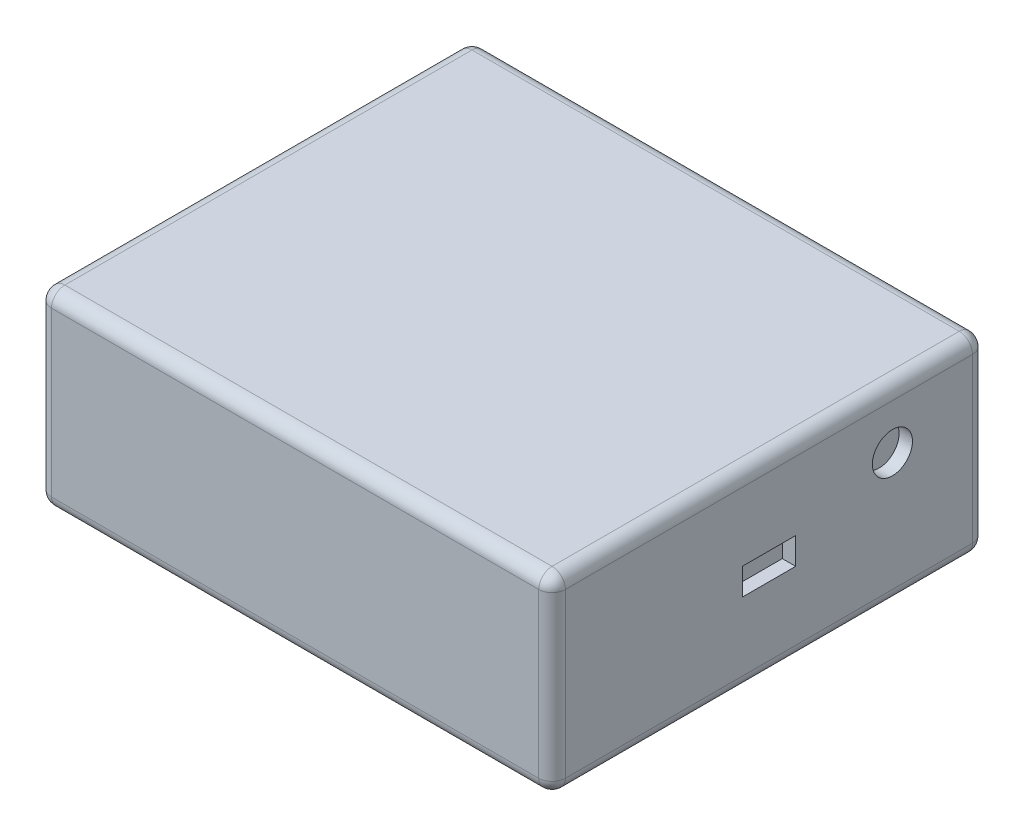
ISO-10303-21;
HEADER;
FILE_DESCRIPTION(('STEP AP214'),'2;1');
FILE_NAME('part.step','',(''),(''),'','','');
FILE_SCHEMA(('AUTOMOTIVE_DESIGN { 1 0 10303 214 1 1 1 1 }'));
ENDSEC;
DATA;
#1=APPLICATION_CONTEXT('core data for automotive mechanical design processes');
#2=APPLICATION_PROTOCOL_DEFINITION('international standard','automotive_design',2000,#1);
#3=PRODUCT_CONTEXT('',#1,'mechanical');
#4=PRODUCT('Part','Part','',(#3));
#5=PRODUCT_RELATED_PRODUCT_CATEGORY('part','',(#4));
#6=PRODUCT_DEFINITION_FORMATION('','',#4);
#7=PRODUCT_DEFINITION_CONTEXT('part definition',#1,'design');
#8=PRODUCT_DEFINITION('design','',#6,#7);
#9=PRODUCT_DEFINITION_SHAPE('','',#8);
#10=(LENGTH_UNIT() NAMED_UNIT(*) SI_UNIT(.MILLI.,.METRE.));
#11=(NAMED_UNIT(*) PLANE_ANGLE_UNIT() SI_UNIT($,.RADIAN.));
#12=(NAMED_UNIT(*) SI_UNIT($,.STERADIAN.) SOLID_ANGLE_UNIT());
#13=UNCERTAINTY_MEASURE_WITH_UNIT(LENGTH_MEASURE(1.E-05),#10,'distance_accuracy_value','');
#14=(GEOMETRIC_REPRESENTATION_CONTEXT(3) GLOBAL_UNCERTAINTY_ASSIGNED_CONTEXT((#13)) GLOBAL_UNIT_ASSIGNED_CONTEXT((#10,
#11,#12)) REPRESENTATION_CONTEXT('',''));
#15=CARTESIAN_POINT('',(0.,0.,0.));
#16=DIRECTION('',(0.,0.,1.));
#17=DIRECTION('',(1.,0.,0.));
#18=AXIS2_PLACEMENT_3D('',#15,#16,#17);
#19=CARTESIAN_POINT('',(38.5,28.5,32.5));
#20=DIRECTION('',(-1.,0.,0.));
#21=DIRECTION('',(0.,0.,1.));
#22=AXIS2_PLACEMENT_3D('',#19,#20,#21);
#23=PLANE('',#22);
#24=DIRECTION('',(0.,0.,1.));
#25=VECTOR('',#24,1.);
#26=CARTESIAN_POINT('',(38.5,16.25,4.));
#27=LINE('',#26,#25);
#28=CARTESIAN_POINT('',(38.5,16.25,-4.));
#29=VERTEX_POINT('',#28);
#30=CARTESIAN_POINT('',(38.5,16.25,4.));
#31=VERTEX_POINT('',#30);
#32=EDGE_CURVE('E189',#29,#31,#27,.T.);
#33=ORIENTED_EDGE('',*,*,#32,.F.);
#34=DIRECTION('',(0.,1.,0.));
#35=VECTOR('',#34,1.);
#36=CARTESIAN_POINT('',(38.5,12.25,-4.));
#37=LINE('',#36,#35);
#38=CARTESIAN_POINT('',(38.5,12.25,-4.));
#39=VERTEX_POINT('',#38);
#40=EDGE_CURVE('E56',#39,#29,#37,.T.);
#41=ORIENTED_EDGE('',*,*,#40,.F.);
#42=DIRECTION('',(0.,0.,-1.));
#43=VECTOR('',#42,1.);
#44=CARTESIAN_POINT('',(38.5,12.25,4.));
#45=LINE('',#44,#43);
#46=CARTESIAN_POINT('',(38.5,12.25,4.));
#47=VERTEX_POINT('',#46);
#48=EDGE_CURVE('E176',#47,#39,#45,.T.);
#49=ORIENTED_EDGE('',*,*,#48,.F.);
#50=DIRECTION('',(0.,-1.,0.));
#51=VECTOR('',#50,1.);
#52=CARTESIAN_POINT('',(38.5,12.25,4.));
#53=LINE('',#52,#51);
#54=EDGE_CURVE('E180',#31,#47,#53,.T.);
#55=ORIENTED_EDGE('',*,*,#54,.F.);
#56=EDGE_LOOP('',(#33,#41,#49,#55));
#57=FACE_BOUND('',#56,.T.);
#58=CARTESIAN_POINT('',(38.5,19.75,-18.5));
#59=DIRECTION('',(1.,0.,0.));
#60=DIRECTION('',(0.,0.,-1.));
#61=AXIS2_PLACEMENT_3D('',#58,#59,#60);
#62=CIRCLE('',#61,3.);
#63=CARTESIAN_POINT('',(38.5,19.75,-21.5));
#64=VERTEX_POINT('',#63);
#65=EDGE_CURVE('E208',#64,#64,#62,.T.);
#66=ORIENTED_EDGE('',*,*,#65,.F.);
#67=EDGE_LOOP('',(#66));
#68=FACE_BOUND('',#67,.T.);
#69=DIRECTION('',(0.,0.,-1.));
#70=VECTOR('',#69,1.);
#71=CARTESIAN_POINT('',(38.5,26.5,32.5));
#72=LINE('',#71,#70);
#73=CARTESIAN_POINT('',(38.5,26.5,-30.5));
#74=VERTEX_POINT('',#73);
#75=CARTESIAN_POINT('',(38.5,26.5,30.5));
#76=VERTEX_POINT('',#75);
#77=EDGE_CURVE('E231',#74,#76,#72,.F.);
#78=ORIENTED_EDGE('',*,*,#77,.T.);
#79=DIRECTION('',(0.,-1.,0.));
#80=VECTOR('',#79,1.);
#81=CARTESIAN_POINT('',(38.5,28.5,30.5));
#82=LINE('',#81,#80);
#83=CARTESIAN_POINT('',(38.5,2.,30.5));
#84=VERTEX_POINT('',#83);
#85=EDGE_CURVE('E235',#76,#84,#82,.T.);
#86=ORIENTED_EDGE('',*,*,#85,.T.);
#87=DIRECTION('',(0.,0.,-1.));
#88=VECTOR('',#87,1.);
#89=CARTESIAN_POINT('',(38.5,2.,-32.5));
#90=LINE('',#89,#88);
#91=CARTESIAN_POINT('',(38.5,2.,-30.5));
#92=VERTEX_POINT('',#91);
#93=EDGE_CURVE('E228',#84,#92,#90,.T.);
#94=ORIENTED_EDGE('',*,*,#93,.T.);
#95=DIRECTION('',(0.,-1.,0.));
#96=VECTOR('',#95,1.);
#97=CARTESIAN_POINT('',(38.5,28.5,-30.5));
#98=LINE('',#97,#96);
#99=EDGE_CURVE('E225',#92,#74,#98,.F.);
#100=ORIENTED_EDGE('',*,*,#99,.T.);
#101=EDGE_LOOP('',(#78,#86,#94,#100));
#102=FACE_BOUND('',#101,.T.);
#103=ADVANCED_FACE('F38',(#57,#68,#102),#23,.F.);
#104=CARTESIAN_POINT('',(-38.5,28.5,-32.5));
#105=DIRECTION('',(0.,0.,1.));
#106=DIRECTION('',(1.,0.,0.));
#107=AXIS2_PLACEMENT_3D('',#104,#105,#106);
#108=PLANE('',#107);
#109=DIRECTION('',(-1.,0.,0.));
#110=VECTOR('',#109,1.);
#111=CARTESIAN_POINT('',(-38.5,26.5,-32.5));
#112=LINE('',#111,#110);
#113=CARTESIAN_POINT('',(-36.5,26.5,-32.5));
#114=VERTEX_POINT('',#113);
#115=CARTESIAN_POINT('',(36.5,26.5,-32.5));
#116=VERTEX_POINT('',#115);
#117=EDGE_CURVE('E48',#114,#116,#112,.F.);
#118=ORIENTED_EDGE('',*,*,#117,.T.);
#119=DIRECTION('',(0.,-1.,0.));
#120=VECTOR('',#119,1.);
#121=CARTESIAN_POINT('',(36.5,28.5,-32.5));
#122=LINE('',#121,#120);
#123=CARTESIAN_POINT('',(36.5,2.,-32.5));
#124=VERTEX_POINT('',#123);
#125=EDGE_CURVE('E11',#116,#124,#122,.T.);
#126=ORIENTED_EDGE('',*,*,#125,.T.);
#127=DIRECTION('',(-1.,0.,0.));
#128=VECTOR('',#127,1.);
#129=CARTESIAN_POINT('',(-38.5,2.,-32.5));
#130=LINE('',#129,#128);
#131=CARTESIAN_POINT('',(-36.5,2.,-32.5));
#132=VERTEX_POINT('',#131);
#133=EDGE_CURVE('E277',#124,#132,#130,.T.);
#134=ORIENTED_EDGE('',*,*,#133,.T.);
#135=DIRECTION('',(0.,-1.,0.));
#136=VECTOR('',#135,1.);
#137=CARTESIAN_POINT('',(-36.5,28.5,-32.5));
#138=LINE('',#137,#136);
#139=EDGE_CURVE('E280',#132,#114,#138,.F.);
#140=ORIENTED_EDGE('',*,*,#139,.T.);
#141=EDGE_LOOP('',(#118,#126,#134,#140));
#142=FACE_BOUND('',#141,.T.);
#143=ADVANCED_FACE('F455',(#142),#108,.F.);
#144=CARTESIAN_POINT('',(-38.5,28.5,32.5));
#145=DIRECTION('',(1.,0.,0.));
#146=DIRECTION('',(0.,0.,-1.));
#147=AXIS2_PLACEMENT_3D('',#144,#145,#146);
#148=PLANE('',#147);
#149=DIRECTION('',(0.,-1.,0.));
#150=VECTOR('',#149,1.);
#151=CARTESIAN_POINT('',(-38.5,28.5,30.5));
#152=LINE('',#151,#150);
#153=CARTESIAN_POINT('',(-38.5,2.,30.5));
#154=VERTEX_POINT('',#153);
#155=CARTESIAN_POINT('',(-38.5,26.5,30.5));
#156=VERTEX_POINT('',#155);
#157=EDGE_CURVE('E270',#154,#156,#152,.F.);
#158=ORIENTED_EDGE('',*,*,#157,.T.);
#159=DIRECTION('',(0.,0.,1.));
#160=VECTOR('',#159,1.);
#161=CARTESIAN_POINT('',(-38.5,26.5,32.5));
#162=LINE('',#161,#160);
#163=CARTESIAN_POINT('',(-38.5,26.5,-30.5));
#164=VERTEX_POINT('',#163);
#165=EDGE_CURVE('E273',#156,#164,#162,.F.);
#166=ORIENTED_EDGE('',*,*,#165,.T.);
#167=DIRECTION('',(0.,-1.,0.));
#168=VECTOR('',#167,1.);
#169=CARTESIAN_POINT('',(-38.5,28.5,-30.5));
#170=LINE('',#169,#168);
#171=CARTESIAN_POINT('',(-38.5,2.,-30.5));
#172=VERTEX_POINT('',#171);
#173=EDGE_CURVE('E264',#164,#172,#170,.T.);
#174=ORIENTED_EDGE('',*,*,#173,.T.);
#175=DIRECTION('',(0.,0.,1.));
#176=VECTOR('',#175,1.);
#177=CARTESIAN_POINT('',(-38.5,2.,32.5));
#178=LINE('',#177,#176);
#179=EDGE_CURVE('E267',#172,#154,#178,.T.);
#180=ORIENTED_EDGE('',*,*,#179,.T.);
#181=EDGE_LOOP('',(#158,#166,#174,#180));
#182=FACE_BOUND('',#181,.T.);
#183=ADVANCED_FACE('F399',(#182),#148,.F.);
#184=CARTESIAN_POINT('',(-38.5,28.5,32.5));
#185=DIRECTION('',(0.,0.,-1.));
#186=DIRECTION('',(-1.,0.,0.));
#187=AXIS2_PLACEMENT_3D('',#184,#185,#186);
#188=PLANE('',#187);
#189=DIRECTION('',(0.,-1.,0.));
#190=VECTOR('',#189,1.);
#191=CARTESIAN_POINT('',(36.5,28.5,32.5));
#192=LINE('',#191,#190);
#193=CARTESIAN_POINT('',(36.5,2.,32.5));
#194=VERTEX_POINT('',#193);
#195=CARTESIAN_POINT('',(36.5,26.5,32.5));
#196=VERTEX_POINT('',#195);
#197=EDGE_CURVE('E257',#194,#196,#192,.F.);
#198=ORIENTED_EDGE('',*,*,#197,.T.);
#199=DIRECTION('',(1.,0.,0.));
#200=VECTOR('',#199,1.);
#201=CARTESIAN_POINT('',(-38.5,26.5,32.5));
#202=LINE('',#201,#200);
#203=CARTESIAN_POINT('',(-36.5,26.5,32.5));
#204=VERTEX_POINT('',#203);
#205=EDGE_CURVE('E260',#196,#204,#202,.F.);
#206=ORIENTED_EDGE('',*,*,#205,.T.);
#207=DIRECTION('',(0.,-1.,0.));
#208=VECTOR('',#207,1.);
#209=CARTESIAN_POINT('',(-36.5,28.5,32.5));
#210=LINE('',#209,#208);
#211=CARTESIAN_POINT('',(-36.5,2.,32.5));
#212=VERTEX_POINT('',#211);
#213=EDGE_CURVE('E251',#204,#212,#210,.T.);
#214=ORIENTED_EDGE('',*,*,#213,.T.);
#215=DIRECTION('',(1.,0.,0.));
#216=VECTOR('',#215,1.);
#217=CARTESIAN_POINT('',(38.5,2.,32.5));
#218=LINE('',#217,#216);
#219=EDGE_CURVE('E254',#212,#194,#218,.T.);
#220=ORIENTED_EDGE('',*,*,#219,.T.);
#221=EDGE_LOOP('',(#198,#206,#214,#220));
#222=FACE_BOUND('',#221,.T.);
#223=ADVANCED_FACE('F390',(#222),#188,.F.);
#224=CARTESIAN_POINT('',(0.,28.5,0.));
#225=DIRECTION('',(0.,-1.,0.));
#226=DIRECTION('',(0.,0.,-1.));
#227=AXIS2_PLACEMENT_3D('',#224,#225,#226);
#228=PLANE('',#227);
#229=DIRECTION('',(1.,0.,0.));
#230=VECTOR('',#229,1.);
#231=CARTESIAN_POINT('',(0.,28.5,30.5));
#232=LINE('',#231,#230);
#233=CARTESIAN_POINT('',(-36.5,28.5,30.5));
#234=VERTEX_POINT('',#233);
#235=CARTESIAN_POINT('',(36.5,28.5,30.5));
#236=VERTEX_POINT('',#235);
#237=EDGE_CURVE('E218',#234,#236,#232,.T.);
#238=ORIENTED_EDGE('',*,*,#237,.T.);
#239=DIRECTION('',(0.,0.,-1.));
#240=VECTOR('',#239,1.);
#241=CARTESIAN_POINT('',(36.5,28.5,0.));
#242=LINE('',#241,#240);
#243=CARTESIAN_POINT('',(36.5,28.5,-30.5));
#244=VERTEX_POINT('',#243);
#245=EDGE_CURVE('E221',#236,#244,#242,.T.);
#246=ORIENTED_EDGE('',*,*,#245,.T.);
#247=DIRECTION('',(-1.,0.,0.));
#248=VECTOR('',#247,1.);
#249=CARTESIAN_POINT('',(0.,28.5,-30.5));
#250=LINE('',#249,#248);
#251=CARTESIAN_POINT('',(-36.5,28.5,-30.5));
#252=VERTEX_POINT('',#251);
#253=EDGE_CURVE('E212',#244,#252,#250,.T.);
#254=ORIENTED_EDGE('',*,*,#253,.T.);
#255=DIRECTION('',(0.,0.,1.));
#256=VECTOR('',#255,1.);
#257=CARTESIAN_POINT('',(-36.5,28.5,0.));
#258=LINE('',#257,#256);
#259=EDGE_CURVE('E215',#252,#234,#258,.T.);
#260=ORIENTED_EDGE('',*,*,#259,.T.);
#261=EDGE_LOOP('',(#238,#246,#254,#260));
#262=FACE_BOUND('',#261,.T.);
#263=ADVANCED_FACE('F502',(#262),#228,.F.);
#264=CARTESIAN_POINT('',(0.,0.,0.));
#265=DIRECTION('',(0.,-1.,0.));
#266=DIRECTION('',(0.,0.,-1.));
#267=AXIS2_PLACEMENT_3D('',#264,#265,#266);
#268=PLANE('',#267);
#269=DIRECTION('',(-1.,0.,0.));
#270=VECTOR('',#269,1.);
#271=CARTESIAN_POINT('',(38.5,0.,-30.5));
#272=LINE('',#271,#270);
#273=CARTESIAN_POINT('',(-36.5,0.,-30.5));
#274=VERTEX_POINT('',#273);
#275=CARTESIAN_POINT('',(36.5,0.,-30.5));
#276=VERTEX_POINT('',#275);
#277=EDGE_CURVE('E238',#274,#276,#272,.F.);
#278=ORIENTED_EDGE('',*,*,#277,.T.);
#279=DIRECTION('',(0.,0.,-1.));
#280=VECTOR('',#279,1.);
#281=CARTESIAN_POINT('',(36.5,0.,32.5));
#282=LINE('',#281,#280);
#283=CARTESIAN_POINT('',(36.5,0.,30.5));
#284=VERTEX_POINT('',#283);
#285=EDGE_CURVE('E247',#276,#284,#282,.F.);
#286=ORIENTED_EDGE('',*,*,#285,.T.);
#287=DIRECTION('',(1.,0.,0.));
#288=VECTOR('',#287,1.);
#289=CARTESIAN_POINT('',(-38.5,0.,30.5));
#290=LINE('',#289,#288);
#291=CARTESIAN_POINT('',(-36.5,0.,30.5));
#292=VERTEX_POINT('',#291);
#293=EDGE_CURVE('E244',#284,#292,#290,.F.);
#294=ORIENTED_EDGE('',*,*,#293,.T.);
#295=DIRECTION('',(0.,0.,1.));
#296=VECTOR('',#295,1.);
#297=CARTESIAN_POINT('',(-36.5,0.,-32.5));
#298=LINE('',#297,#296);
#299=EDGE_CURVE('E241',#292,#274,#298,.F.);
#300=ORIENTED_EDGE('',*,*,#299,.T.);
#301=EDGE_LOOP('',(#278,#286,#294,#300));
#302=FACE_BOUND('',#301,.T.);
#303=ADVANCED_FACE('F421',(#302),#268,.T.);
#304=CARTESIAN_POINT('',(-36.5,2.,32.5));
#305=DIRECTION('',(0.,0.,-1.));
#306=DIRECTION('',(-1.,0.,0.));
#307=AXIS2_PLACEMENT_3D('',#304,#305,#306);
#308=CYLINDRICAL_SURFACE('',#307,2.);
#309=CARTESIAN_POINT('',(-36.5,2.,30.5));
#310=DIRECTION('',(0.,0.,1.));
#311=DIRECTION('',(1.,0.,0.));
#312=AXIS2_PLACEMENT_3D('',#309,#310,#311);
#313=CIRCLE('',#312,2.);
#314=EDGE_CURVE('E42',#154,#292,#313,.T.);
#315=ORIENTED_EDGE('',*,*,#314,.F.);
#316=ORIENTED_EDGE('',*,*,#179,.F.);
#317=CARTESIAN_POINT('',(-36.5,2.,-30.5));
#318=DIRECTION('',(0.,0.,-1.));
#319=DIRECTION('',(-1.,0.,0.));
#320=AXIS2_PLACEMENT_3D('',#317,#318,#319);
#321=CIRCLE('',#320,2.);
#322=EDGE_CURVE('E365',#274,#172,#321,.T.);
#323=ORIENTED_EDGE('',*,*,#322,.F.);
#324=ORIENTED_EDGE('',*,*,#299,.F.);
#325=EDGE_LOOP('',(#315,#316,#323,#324));
#326=FACE_BOUND('',#325,.T.);
#327=ADVANCED_FACE('F40',(#326),#308,.T.);
#328=CARTESIAN_POINT('',(-36.5,2.,30.5));
#329=DIRECTION('',(0.,-1.,0.));
#330=DIRECTION('',(0.,0.,-1.));
#331=AXIS2_PLACEMENT_3D('',#328,#329,#330);
#332=SPHERICAL_SURFACE('',#331,2.);
#333=CARTESIAN_POINT('',(-36.5,2.,30.5));
#334=DIRECTION('',(0.,-1.,0.));
#335=DIRECTION('',(0.,0.,-1.));
#336=AXIS2_PLACEMENT_3D('',#333,#334,#335);
#337=CIRCLE('',#336,2.);
#338=EDGE_CURVE('E358',#154,#212,#337,.F.);
#339=ORIENTED_EDGE('',*,*,#338,.F.);
#340=ORIENTED_EDGE('',*,*,#314,.T.);
#341=CARTESIAN_POINT('',(-36.5,2.,30.5));
#342=DIRECTION('',(-1.,0.,0.));
#343=DIRECTION('',(0.,0.,1.));
#344=AXIS2_PLACEMENT_3D('',#341,#342,#343);
#345=CIRCLE('',#344,2.);
#346=EDGE_CURVE('E362',#212,#292,#345,.F.);
#347=ORIENTED_EDGE('',*,*,#346,.F.);
#348=EDGE_LOOP('',(#339,#340,#347));
#349=FACE_BOUND('',#348,.T.);
#350=ADVANCED_FACE('F378',(#349),#332,.T.);
#351=CARTESIAN_POINT('',(-36.5,2.,-30.5));
#352=DIRECTION('',(-1.,0.,0.));
#353=DIRECTION('',(0.,0.,1.));
#354=AXIS2_PLACEMENT_3D('',#351,#352,#353);
#355=SPHERICAL_SURFACE('',#354,2.);
#356=CARTESIAN_POINT('',(-36.5,2.,-30.5));
#357=DIRECTION('',(-1.,0.,0.));
#358=DIRECTION('',(0.,0.,1.));
#359=AXIS2_PLACEMENT_3D('',#356,#357,#358);
#360=CIRCLE('',#359,2.);
#361=EDGE_CURVE('E350',#274,#132,#360,.F.);
#362=ORIENTED_EDGE('',*,*,#361,.F.);
#363=ORIENTED_EDGE('',*,*,#322,.T.);
#364=CARTESIAN_POINT('',(-36.5,2.,-30.5));
#365=DIRECTION('',(0.,-1.,0.));
#366=DIRECTION('',(0.,0.,-1.));
#367=AXIS2_PLACEMENT_3D('',#364,#365,#366);
#368=CIRCLE('',#367,2.);
#369=EDGE_CURVE('E354',#132,#172,#368,.F.);
#370=ORIENTED_EDGE('',*,*,#369,.F.);
#371=EDGE_LOOP('',(#362,#363,#370));
#372=FACE_BOUND('',#371,.T.);
#373=ADVANCED_FACE('F414',(#372),#355,.T.);
#374=CARTESIAN_POINT('',(-38.5,2.,30.5));
#375=DIRECTION('',(-1.,0.,0.));
#376=DIRECTION('',(0.,0.,1.));
#377=AXIS2_PLACEMENT_3D('',#374,#375,#376);
#378=CYLINDRICAL_SURFACE('',#377,2.);
#379=ORIENTED_EDGE('',*,*,#346,.T.);
#380=ORIENTED_EDGE('',*,*,#293,.F.);
#381=CARTESIAN_POINT('',(36.5,2.,30.5));
#382=DIRECTION('',(1.,0.,0.));
#383=DIRECTION('',(0.,0.,-1.));
#384=AXIS2_PLACEMENT_3D('',#381,#382,#383);
#385=CIRCLE('',#384,2.);
#386=EDGE_CURVE('E343',#194,#284,#385,.T.);
#387=ORIENTED_EDGE('',*,*,#386,.F.);
#388=ORIENTED_EDGE('',*,*,#219,.F.);
#389=EDGE_LOOP('',(#379,#380,#387,#388));
#390=FACE_BOUND('',#389,.T.);
#391=ADVANCED_FACE('F386',(#390),#378,.T.);
#392=CARTESIAN_POINT('',(-36.5,28.5,30.5));
#393=DIRECTION('',(0.,-1.,0.));
#394=DIRECTION('',(0.,0.,-1.));
#395=AXIS2_PLACEMENT_3D('',#392,#393,#394);
#396=CYLINDRICAL_SURFACE('',#395,2.);
#397=ORIENTED_EDGE('',*,*,#338,.T.);
#398=ORIENTED_EDGE('',*,*,#213,.F.);
#399=CARTESIAN_POINT('',(-36.5,26.5,30.5));
#400=DIRECTION('',(0.,1.,0.));
#401=DIRECTION('',(0.,0.,1.));
#402=AXIS2_PLACEMENT_3D('',#399,#400,#401);
#403=CIRCLE('',#402,2.);
#404=EDGE_CURVE('E339',#156,#204,#403,.T.);
#405=ORIENTED_EDGE('',*,*,#404,.F.);
#406=ORIENTED_EDGE('',*,*,#157,.F.);
#407=EDGE_LOOP('',(#397,#398,#405,#406));
#408=FACE_BOUND('',#407,.T.);
#409=ADVANCED_FACE('F396',(#408),#396,.T.);
#410=CARTESIAN_POINT('',(-36.5,26.5,0.));
#411=DIRECTION('',(0.,0.,1.));
#412=DIRECTION('',(1.,0.,0.));
#413=AXIS2_PLACEMENT_3D('',#410,#411,#412);
#414=CYLINDRICAL_SURFACE('',#413,2.);
#415=CARTESIAN_POINT('',(-36.5,26.5,-30.5));
#416=DIRECTION('',(0.,0.,-1.));
#417=DIRECTION('',(0.,1.,0.));
#418=AXIS2_PLACEMENT_3D('',#415,#416,#417);
#419=CIRCLE('',#418,2.);
#420=EDGE_CURVE('E331',#164,#252,#419,.T.);
#421=ORIENTED_EDGE('',*,*,#420,.F.);
#422=ORIENTED_EDGE('',*,*,#165,.F.);
#423=CARTESIAN_POINT('',(-36.5,26.5,30.5));
#424=DIRECTION('',(0.,0.,1.));
#425=DIRECTION('',(1.,0.,0.));
#426=AXIS2_PLACEMENT_3D('',#423,#424,#425);
#427=CIRCLE('',#426,2.);
#428=EDGE_CURVE('E335',#234,#156,#427,.T.);
#429=ORIENTED_EDGE('',*,*,#428,.F.);
#430=ORIENTED_EDGE('',*,*,#259,.F.);
#431=EDGE_LOOP('',(#421,#422,#429,#430));
#432=FACE_BOUND('',#431,.T.);
#433=ADVANCED_FACE('F403',(#432),#414,.T.);
#434=CARTESIAN_POINT('',(-36.5,28.5,-30.5));
#435=DIRECTION('',(0.,-1.,0.));
#436=DIRECTION('',(0.,0.,-1.));
#437=AXIS2_PLACEMENT_3D('',#434,#435,#436);
#438=CYLINDRICAL_SURFACE('',#437,2.);
#439=ORIENTED_EDGE('',*,*,#369,.T.);
#440=ORIENTED_EDGE('',*,*,#173,.F.);
#441=CARTESIAN_POINT('',(-36.5,26.5,-30.5));
#442=DIRECTION('',(0.,1.,0.));
#443=DIRECTION('',(0.,0.,1.));
#444=AXIS2_PLACEMENT_3D('',#441,#442,#443);
#445=CIRCLE('',#444,2.);
#446=EDGE_CURVE('E328',#114,#164,#445,.T.);
#447=ORIENTED_EDGE('',*,*,#446,.F.);
#448=ORIENTED_EDGE('',*,*,#139,.F.);
#449=EDGE_LOOP('',(#439,#440,#447,#448));
#450=FACE_BOUND('',#449,.T.);
#451=ADVANCED_FACE('F411',(#450),#438,.T.);
#452=CARTESIAN_POINT('',(-38.5,2.,-30.5));
#453=DIRECTION('',(1.,0.,0.));
#454=DIRECTION('',(0.,0.,-1.));
#455=AXIS2_PLACEMENT_3D('',#452,#453,#454);
#456=CYLINDRICAL_SURFACE('',#455,2.);
#457=ORIENTED_EDGE('',*,*,#361,.T.);
#458=ORIENTED_EDGE('',*,*,#133,.F.);
#459=CARTESIAN_POINT('',(36.5,2.,-30.5));
#460=DIRECTION('',(1.,0.,0.));
#461=DIRECTION('',(0.,0.,-1.));
#462=AXIS2_PLACEMENT_3D('',#459,#460,#461);
#463=CIRCLE('',#462,2.);
#464=EDGE_CURVE('E324',#276,#124,#463,.T.);
#465=ORIENTED_EDGE('',*,*,#464,.F.);
#466=ORIENTED_EDGE('',*,*,#277,.F.);
#467=EDGE_LOOP('',(#457,#458,#465,#466));
#468=FACE_BOUND('',#467,.T.);
#469=ADVANCED_FACE('F418',(#468),#456,.T.);
#470=CARTESIAN_POINT('',(36.5,2.,32.5));
#471=DIRECTION('',(0.,0.,1.));
#472=DIRECTION('',(1.,0.,0.));
#473=AXIS2_PLACEMENT_3D('',#470,#471,#472);
#474=CYLINDRICAL_SURFACE('',#473,2.);
#475=CARTESIAN_POINT('',(36.5,2.,30.5));
#476=DIRECTION('',(0.,0.,1.));
#477=DIRECTION('',(1.,0.,0.));
#478=AXIS2_PLACEMENT_3D('',#475,#476,#477);
#479=CIRCLE('',#478,2.);
#480=EDGE_CURVE('E346',#284,#84,#479,.T.);
#481=ORIENTED_EDGE('',*,*,#480,.F.);
#482=ORIENTED_EDGE('',*,*,#285,.F.);
#483=CARTESIAN_POINT('',(36.5,2.,-30.5));
#484=DIRECTION('',(0.,0.,-1.));
#485=DIRECTION('',(-1.,0.,0.));
#486=AXIS2_PLACEMENT_3D('',#483,#484,#485);
#487=CIRCLE('',#486,2.);
#488=EDGE_CURVE('E320',#92,#276,#487,.T.);
#489=ORIENTED_EDGE('',*,*,#488,.F.);
#490=ORIENTED_EDGE('',*,*,#93,.F.);
#491=EDGE_LOOP('',(#481,#482,#489,#490));
#492=FACE_BOUND('',#491,.T.);
#493=ADVANCED_FACE('F425',(#492),#474,.T.);
#494=CARTESIAN_POINT('',(36.5,2.,30.5));
#495=DIRECTION('',(0.,-1.,0.));
#496=DIRECTION('',(0.,0.,-1.));
#497=AXIS2_PLACEMENT_3D('',#494,#495,#496);
#498=SPHERICAL_SURFACE('',#497,2.);
#499=ORIENTED_EDGE('',*,*,#386,.T.);
#500=ORIENTED_EDGE('',*,*,#480,.T.);
#501=CARTESIAN_POINT('',(36.5,2.,30.5));
#502=DIRECTION('',(0.,-1.,0.));
#503=DIRECTION('',(0.,0.,-1.));
#504=AXIS2_PLACEMENT_3D('',#501,#502,#503);
#505=CIRCLE('',#504,2.);
#506=EDGE_CURVE('E316',#194,#84,#505,.F.);
#507=ORIENTED_EDGE('',*,*,#506,.F.);
#508=EDGE_LOOP('',(#499,#500,#507));
#509=FACE_BOUND('',#508,.T.);
#510=ADVANCED_FACE('F429',(#509),#498,.T.);
#511=CARTESIAN_POINT('',(-36.5,26.5,30.5));
#512=DIRECTION('',(-1.,0.,0.));
#513=DIRECTION('',(0.,0.,1.));
#514=AXIS2_PLACEMENT_3D('',#511,#512,#513);
#515=SPHERICAL_SURFACE('',#514,2.);
#516=ORIENTED_EDGE('',*,*,#428,.T.);
#517=ORIENTED_EDGE('',*,*,#404,.T.);
#518=CARTESIAN_POINT('',(-36.5,26.5,30.5));
#519=DIRECTION('',(-1.,0.,0.));
#520=DIRECTION('',(0.,0.,1.));
#521=AXIS2_PLACEMENT_3D('',#518,#519,#520);
#522=CIRCLE('',#521,2.);
#523=EDGE_CURVE('E313',#234,#204,#522,.F.);
#524=ORIENTED_EDGE('',*,*,#523,.F.);
#525=EDGE_LOOP('',(#516,#517,#524));
#526=FACE_BOUND('',#525,.T.);
#527=ADVANCED_FACE('F443',(#526),#515,.T.);
#528=CARTESIAN_POINT('',(-36.5,26.5,-30.5));
#529=DIRECTION('',(-1.,0.,0.));
#530=DIRECTION('',(0.,0.,1.));
#531=AXIS2_PLACEMENT_3D('',#528,#529,#530);
#532=SPHERICAL_SURFACE('',#531,2.);
#533=ORIENTED_EDGE('',*,*,#446,.T.);
#534=ORIENTED_EDGE('',*,*,#420,.T.);
#535=CARTESIAN_POINT('',(-36.5,26.5,-30.5));
#536=DIRECTION('',(-1.,0.,0.));
#537=DIRECTION('',(0.,0.,1.));
#538=AXIS2_PLACEMENT_3D('',#535,#536,#537);
#539=CIRCLE('',#538,2.);
#540=EDGE_CURVE('E309',#114,#252,#539,.F.);
#541=ORIENTED_EDGE('',*,*,#540,.F.);
#542=EDGE_LOOP('',(#533,#534,#541));
#543=FACE_BOUND('',#542,.T.);
#544=ADVANCED_FACE('F445',(#543),#532,.T.);
#545=CARTESIAN_POINT('',(36.5,2.,-30.5));
#546=DIRECTION('',(0.,-1.,0.));
#547=DIRECTION('',(0.,0.,-1.));
#548=AXIS2_PLACEMENT_3D('',#545,#546,#547);
#549=SPHERICAL_SURFACE('',#548,2.);
#550=ORIENTED_EDGE('',*,*,#488,.T.);
#551=ORIENTED_EDGE('',*,*,#464,.T.);
#552=CARTESIAN_POINT('',(36.5,2.,-30.5));
#553=DIRECTION('',(0.,-1.,0.));
#554=DIRECTION('',(0.,0.,-1.));
#555=AXIS2_PLACEMENT_3D('',#552,#553,#554);
#556=CIRCLE('',#555,2.);
#557=EDGE_CURVE('E306',#92,#124,#556,.F.);
#558=ORIENTED_EDGE('',*,*,#557,.F.);
#559=EDGE_LOOP('',(#550,#551,#558));
#560=FACE_BOUND('',#559,.T.);
#561=ADVANCED_FACE('F451',(#560),#549,.T.);
#562=CARTESIAN_POINT('',(36.5,28.5,30.5));
#563=DIRECTION('',(0.,-1.,0.));
#564=DIRECTION('',(0.,0.,-1.));
#565=AXIS2_PLACEMENT_3D('',#562,#563,#564);
#566=CYLINDRICAL_SURFACE('',#565,2.);
#567=ORIENTED_EDGE('',*,*,#506,.T.);
#568=ORIENTED_EDGE('',*,*,#85,.F.);
#569=CARTESIAN_POINT('',(36.5,26.5,30.5));
#570=DIRECTION('',(0.,1.,0.));
#571=DIRECTION('',(0.,0.,1.));
#572=AXIS2_PLACEMENT_3D('',#569,#570,#571);
#573=CIRCLE('',#572,2.);
#574=EDGE_CURVE('E302',#196,#76,#573,.T.);
#575=ORIENTED_EDGE('',*,*,#574,.F.);
#576=ORIENTED_EDGE('',*,*,#197,.F.);
#577=EDGE_LOOP('',(#567,#568,#575,#576));
#578=FACE_BOUND('',#577,.T.);
#579=ADVANCED_FACE('F432',(#578),#566,.T.);
#580=CARTESIAN_POINT('',(0.,26.5,30.5));
#581=DIRECTION('',(1.,0.,0.));
#582=DIRECTION('',(0.,0.,-1.));
#583=AXIS2_PLACEMENT_3D('',#580,#581,#582);
#584=CYLINDRICAL_SURFACE('',#583,2.);
#585=ORIENTED_EDGE('',*,*,#523,.T.);
#586=ORIENTED_EDGE('',*,*,#205,.F.);
#587=CARTESIAN_POINT('',(36.5,26.5,30.5));
#588=DIRECTION('',(1.,0.,0.));
#589=DIRECTION('',(0.,0.,-1.));
#590=AXIS2_PLACEMENT_3D('',#587,#588,#589);
#591=CIRCLE('',#590,2.);
#592=EDGE_CURVE('E298',#236,#196,#591,.T.);
#593=ORIENTED_EDGE('',*,*,#592,.F.);
#594=ORIENTED_EDGE('',*,*,#237,.F.);
#595=EDGE_LOOP('',(#585,#586,#593,#594));
#596=FACE_BOUND('',#595,.T.);
#597=ADVANCED_FACE('F441',(#596),#584,.T.);
#598=CARTESIAN_POINT('',(0.,26.5,-30.5));
#599=DIRECTION('',(-1.,0.,0.));
#600=DIRECTION('',(0.,0.,1.));
#601=AXIS2_PLACEMENT_3D('',#598,#599,#600);
#602=CYLINDRICAL_SURFACE('',#601,2.);
#603=ORIENTED_EDGE('',*,*,#540,.T.);
#604=ORIENTED_EDGE('',*,*,#253,.F.);
#605=CARTESIAN_POINT('',(36.5,26.5,-30.5));
#606=DIRECTION('',(1.,0.,0.));
#607=DIRECTION('',(0.,1.,0.));
#608=AXIS2_PLACEMENT_3D('',#605,#606,#607);
#609=CIRCLE('',#608,2.);
#610=EDGE_CURVE('E294',#116,#244,#609,.T.);
#611=ORIENTED_EDGE('',*,*,#610,.F.);
#612=ORIENTED_EDGE('',*,*,#117,.F.);
#613=EDGE_LOOP('',(#603,#604,#611,#612));
#614=FACE_BOUND('',#613,.T.);
#615=ADVANCED_FACE('F481',(#614),#602,.T.);
#616=CARTESIAN_POINT('',(36.5,28.5,-30.5));
#617=DIRECTION('',(0.,-1.,0.));
#618=DIRECTION('',(0.,0.,-1.));
#619=AXIS2_PLACEMENT_3D('',#616,#617,#618);
#620=CYLINDRICAL_SURFACE('',#619,2.);
#621=ORIENTED_EDGE('',*,*,#557,.T.);
#622=ORIENTED_EDGE('',*,*,#125,.F.);
#623=CARTESIAN_POINT('',(36.5,26.5,-30.5));
#624=DIRECTION('',(0.,1.,0.));
#625=DIRECTION('',(0.,0.,1.));
#626=AXIS2_PLACEMENT_3D('',#623,#624,#625);
#627=CIRCLE('',#626,2.);
#628=EDGE_CURVE('E290',#74,#116,#627,.T.);
#629=ORIENTED_EDGE('',*,*,#628,.F.);
#630=ORIENTED_EDGE('',*,*,#99,.F.);
#631=EDGE_LOOP('',(#621,#622,#629,#630));
#632=FACE_BOUND('',#631,.T.);
#633=ADVANCED_FACE('F478',(#632),#620,.T.);
#634=CARTESIAN_POINT('',(36.5,26.5,30.5));
#635=DIRECTION('',(0.,0.,1.));
#636=DIRECTION('',(1.,0.,0.));
#637=AXIS2_PLACEMENT_3D('',#634,#635,#636);
#638=SPHERICAL_SURFACE('',#637,2.);
#639=ORIENTED_EDGE('',*,*,#592,.T.);
#640=ORIENTED_EDGE('',*,*,#574,.T.);
#641=CARTESIAN_POINT('',(36.5,26.5,30.5));
#642=DIRECTION('',(0.,0.,1.));
#643=DIRECTION('',(1.,0.,0.));
#644=AXIS2_PLACEMENT_3D('',#641,#642,#643);
#645=CIRCLE('',#644,2.);
#646=EDGE_CURVE('E287',#236,#76,#645,.F.);
#647=ORIENTED_EDGE('',*,*,#646,.F.);
#648=EDGE_LOOP('',(#639,#640,#647));
#649=FACE_BOUND('',#648,.T.);
#650=ADVANCED_FACE('F437',(#649),#638,.T.);
#651=CARTESIAN_POINT('',(36.5,26.5,-30.5));
#652=DIRECTION('',(0.,0.,-1.));
#653=DIRECTION('',(-1.,0.,0.));
#654=AXIS2_PLACEMENT_3D('',#651,#652,#653);
#655=SPHERICAL_SURFACE('',#654,2.);
#656=ORIENTED_EDGE('',*,*,#628,.T.);
#657=ORIENTED_EDGE('',*,*,#610,.T.);
#658=CARTESIAN_POINT('',(36.5,26.5,-30.5));
#659=DIRECTION('',(0.,0.,-1.));
#660=DIRECTION('',(-1.,0.,0.));
#661=AXIS2_PLACEMENT_3D('',#658,#659,#660);
#662=CIRCLE('',#661,2.);
#663=EDGE_CURVE('E199',#74,#244,#662,.F.);
#664=ORIENTED_EDGE('',*,*,#663,.F.);
#665=EDGE_LOOP('',(#656,#657,#664));
#666=FACE_BOUND('',#665,.T.);
#667=ADVANCED_FACE('F471',(#666),#655,.T.);
#668=CARTESIAN_POINT('',(36.5,26.5,0.));
#669=DIRECTION('',(0.,0.,-1.));
#670=DIRECTION('',(-1.,0.,0.));
#671=AXIS2_PLACEMENT_3D('',#668,#669,#670);
#672=CYLINDRICAL_SURFACE('',#671,2.);
#673=ORIENTED_EDGE('',*,*,#646,.T.);
#674=ORIENTED_EDGE('',*,*,#77,.F.);
#675=ORIENTED_EDGE('',*,*,#663,.T.);
#676=ORIENTED_EDGE('',*,*,#245,.F.);
#677=EDGE_LOOP('',(#673,#674,#675,#676));
#678=FACE_BOUND('',#677,.T.);
#679=ADVANCED_FACE('F467',(#678),#672,.T.);
#680=CARTESIAN_POINT('',(36.5,19.75,-18.5));
#681=DIRECTION('',(1.,0.,0.));
#682=DIRECTION('',(0.,0.,-1.));
#683=AXIS2_PLACEMENT_3D('',#680,#681,#682);
#684=CYLINDRICAL_SURFACE('',#683,3.);
#685=CARTESIAN_POINT('',(36.5,19.75,-18.5));
#686=DIRECTION('',(1.,0.,0.));
#687=DIRECTION('',(0.,0.,-1.));
#688=AXIS2_PLACEMENT_3D('',#685,#686,#687);
#689=CIRCLE('',#688,3.);
#690=CARTESIAN_POINT('',(36.5,19.75,-21.5));
#691=VERTEX_POINT('',#690);
#692=EDGE_CURVE('E190',#691,#691,#689,.T.);
#693=ORIENTED_EDGE('',*,*,#692,.F.);
#694=EDGE_LOOP('',(#693));
#695=FACE_BOUND('',#694,.T.);
#696=ORIENTED_EDGE('',*,*,#65,.T.);
#697=EDGE_LOOP('',(#696));
#698=FACE_BOUND('',#697,.T.);
#699=ADVANCED_FACE('F470',(#695,#698),#684,.F.);
#700=CARTESIAN_POINT('',(36.5,19.75,-18.5));
#701=DIRECTION('',(1.,0.,0.));
#702=DIRECTION('',(0.,0.,-1.));
#703=AXIS2_PLACEMENT_3D('',#700,#701,#702);
#704=PLANE('',#703);
#705=ORIENTED_EDGE('',*,*,#692,.T.);
#706=EDGE_LOOP('',(#705));
#707=FACE_BOUND('',#706,.T.);
#708=ADVANCED_FACE('F671',(#707),#704,.T.);
#709=CARTESIAN_POINT('',(36.5,12.25,-4.));
#710=DIRECTION('',(0.,0.,-1.));
#711=DIRECTION('',(-1.,0.,0.));
#712=AXIS2_PLACEMENT_3D('',#709,#710,#711);
#713=PLANE('',#712);
#714=ORIENTED_EDGE('',*,*,#40,.T.);
#715=DIRECTION('',(1.,0.,0.));
#716=VECTOR('',#715,1.);
#717=CARTESIAN_POINT('',(36.5,16.25,-4.));
#718=LINE('',#717,#716);
#719=CARTESIAN_POINT('',(36.5,16.25,-4.));
#720=VERTEX_POINT('',#719);
#721=EDGE_CURVE('E151',#720,#29,#718,.T.);
#722=ORIENTED_EDGE('',*,*,#721,.F.);
#723=DIRECTION('',(0.,1.,0.));
#724=VECTOR('',#723,1.);
#725=CARTESIAN_POINT('',(36.5,12.25,-4.));
#726=LINE('',#725,#724);
#727=CARTESIAN_POINT('',(36.5,12.25,-4.));
#728=VERTEX_POINT('',#727);
#729=EDGE_CURVE('E155',#728,#720,#726,.T.);
#730=ORIENTED_EDGE('',*,*,#729,.F.);
#731=DIRECTION('',(1.,0.,0.));
#732=VECTOR('',#731,1.);
#733=CARTESIAN_POINT('',(36.5,12.25,-4.));
#734=LINE('',#733,#732);
#735=EDGE_CURVE('E196',#728,#39,#734,.T.);
#736=ORIENTED_EDGE('',*,*,#735,.T.);
#737=EDGE_LOOP('',(#714,#722,#730,#736));
#738=FACE_BOUND('',#737,.T.);
#739=ADVANCED_FACE('F153',(#738),#713,.F.);
#740=CARTESIAN_POINT('',(36.5,12.25,4.));
#741=DIRECTION('',(0.,-1.,0.));
#742=DIRECTION('',(0.,0.,-1.));
#743=AXIS2_PLACEMENT_3D('',#740,#741,#742);
#744=PLANE('',#743);
#745=ORIENTED_EDGE('',*,*,#48,.T.);
#746=ORIENTED_EDGE('',*,*,#735,.F.);
#747=DIRECTION('',(0.,0.,-1.));
#748=VECTOR('',#747,1.);
#749=CARTESIAN_POINT('',(36.5,12.25,4.));
#750=LINE('',#749,#748);
#751=CARTESIAN_POINT('',(36.5,12.25,4.));
#752=VERTEX_POINT('',#751);
#753=EDGE_CURVE('E162',#752,#728,#750,.T.);
#754=ORIENTED_EDGE('',*,*,#753,.F.);
#755=DIRECTION('',(1.,0.,0.));
#756=VECTOR('',#755,1.);
#757=CARTESIAN_POINT('',(36.5,12.25,4.));
#758=LINE('',#757,#756);
#759=EDGE_CURVE('E200',#752,#47,#758,.T.);
#760=ORIENTED_EDGE('',*,*,#759,.T.);
#761=EDGE_LOOP('',(#745,#746,#754,#760));
#762=FACE_BOUND('',#761,.T.);
#763=ADVANCED_FACE('F683',(#762),#744,.F.);
#764=CARTESIAN_POINT('',(36.5,12.25,4.));
#765=DIRECTION('',(0.,0.,1.));
#766=DIRECTION('',(1.,0.,0.));
#767=AXIS2_PLACEMENT_3D('',#764,#765,#766);
#768=PLANE('',#767);
#769=ORIENTED_EDGE('',*,*,#54,.T.);
#770=ORIENTED_EDGE('',*,*,#759,.F.);
#771=DIRECTION('',(0.,-1.,0.));
#772=VECTOR('',#771,1.);
#773=CARTESIAN_POINT('',(36.5,12.25,4.));
#774=LINE('',#773,#772);
#775=CARTESIAN_POINT('',(36.5,16.25,4.));
#776=VERTEX_POINT('',#775);
#777=EDGE_CURVE('E171',#776,#752,#774,.T.);
#778=ORIENTED_EDGE('',*,*,#777,.F.);
#779=DIRECTION('',(1.,0.,0.));
#780=VECTOR('',#779,1.);
#781=CARTESIAN_POINT('',(36.5,16.25,4.));
#782=LINE('',#781,#780);
#783=EDGE_CURVE('E161',#776,#31,#782,.T.);
#784=ORIENTED_EDGE('',*,*,#783,.T.);
#785=EDGE_LOOP('',(#769,#770,#778,#784));
#786=FACE_BOUND('',#785,.T.);
#787=ADVANCED_FACE('F690',(#786),#768,.F.);
#788=CARTESIAN_POINT('',(36.5,16.25,4.));
#789=DIRECTION('',(0.,1.,0.));
#790=DIRECTION('',(0.,0.,1.));
#791=AXIS2_PLACEMENT_3D('',#788,#789,#790);
#792=PLANE('',#791);
#793=ORIENTED_EDGE('',*,*,#32,.T.);
#794=ORIENTED_EDGE('',*,*,#783,.F.);
#795=DIRECTION('',(0.,0.,1.));
#796=VECTOR('',#795,1.);
#797=CARTESIAN_POINT('',(36.5,16.25,4.));
#798=LINE('',#797,#796);
#799=EDGE_CURVE('E165',#720,#776,#798,.T.);
#800=ORIENTED_EDGE('',*,*,#799,.F.);
#801=ORIENTED_EDGE('',*,*,#721,.T.);
#802=EDGE_LOOP('',(#793,#794,#800,#801));
#803=FACE_BOUND('',#802,.T.);
#804=ADVANCED_FACE('F166',(#803),#792,.F.);
#805=CARTESIAN_POINT('',(36.5,0.,0.));
#806=DIRECTION('',(-1.,0.,0.));
#807=DIRECTION('',(0.,0.,1.));
#808=AXIS2_PLACEMENT_3D('',#805,#806,#807);
#809=PLANE('',#808);
#810=ORIENTED_EDGE('',*,*,#729,.T.);
#811=ORIENTED_EDGE('',*,*,#799,.T.);
#812=ORIENTED_EDGE('',*,*,#777,.T.);
#813=ORIENTED_EDGE('',*,*,#753,.T.);
#814=EDGE_LOOP('',(#810,#811,#812,#813));
#815=FACE_BOUND('',#814,.T.);
#816=ADVANCED_FACE('F173',(#815),#809,.F.);
#817=CLOSED_SHELL('',(#103,#143,#183,#223,#263,#303,#327,#350,#373,#391,#409,#433,#451,#469,
#493,#510,#527,#544,#561,#579,#597,#615,#633,#650,#667,#679,#699,#708,#739,#763,#787,#804,#816));
#818=MANIFOLD_SOLID_BREP('B2',#817);
#819=ADVANCED_BREP_SHAPE_REPRESENTATION('',(#18,#818),#14);
#820=SHAPE_DEFINITION_REPRESENTATION(#9,#819);
ENDSEC;
END-ISO-10303-21;
